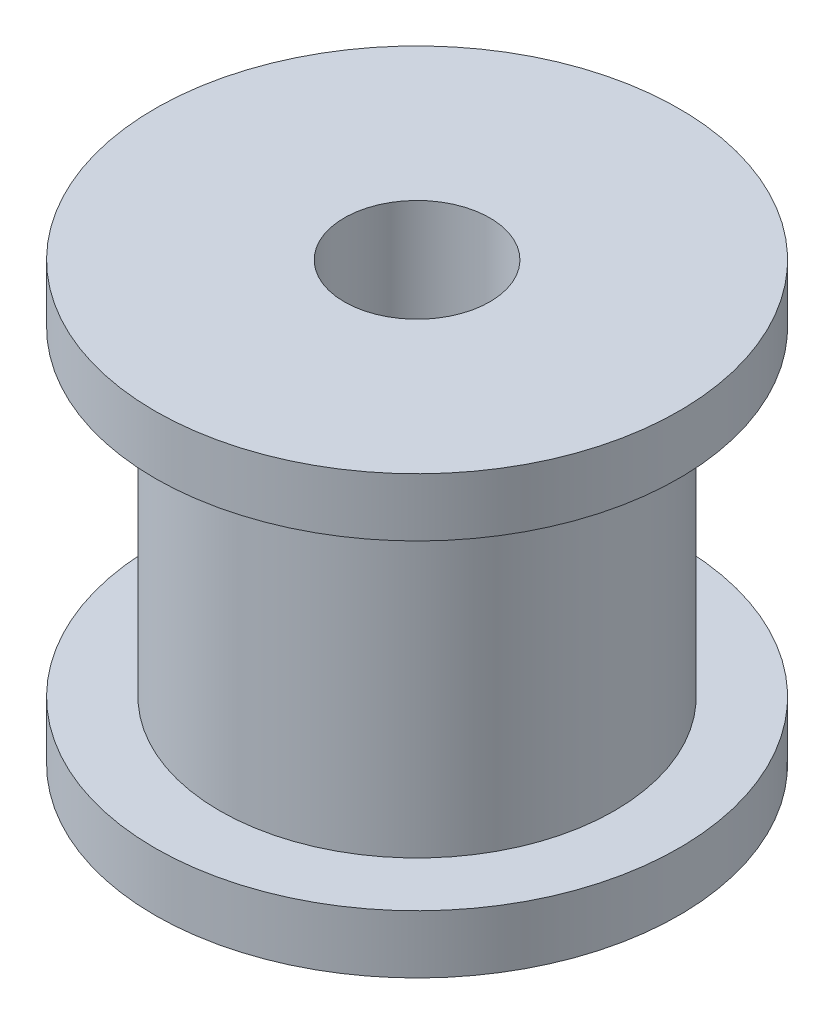
ISO-10303-21;
HEADER;
FILE_DESCRIPTION(('STEP AP214'),'2;1');
FILE_NAME('part.step','',(''),(''),'','','');
FILE_SCHEMA(('AUTOMOTIVE_DESIGN { 1 0 10303 214 1 1 1 1 }'));
ENDSEC;
DATA;
#1=APPLICATION_CONTEXT('core data for automotive mechanical design processes');
#2=APPLICATION_PROTOCOL_DEFINITION('international standard','automotive_design',2000,#1);
#3=PRODUCT_CONTEXT('',#1,'mechanical');
#4=PRODUCT('Part','Part','',(#3));
#5=PRODUCT_RELATED_PRODUCT_CATEGORY('part','',(#4));
#6=PRODUCT_DEFINITION_FORMATION('','',#4);
#7=PRODUCT_DEFINITION_CONTEXT('part definition',#1,'design');
#8=PRODUCT_DEFINITION('design','',#6,#7);
#9=PRODUCT_DEFINITION_SHAPE('','',#8);
#10=(LENGTH_UNIT() NAMED_UNIT(*) SI_UNIT(.MILLI.,.METRE.));
#11=(NAMED_UNIT(*) PLANE_ANGLE_UNIT() SI_UNIT($,.RADIAN.));
#12=(NAMED_UNIT(*) SI_UNIT($,.STERADIAN.) SOLID_ANGLE_UNIT());
#13=UNCERTAINTY_MEASURE_WITH_UNIT(LENGTH_MEASURE(1.E-05),#10,'distance_accuracy_value','');
#14=(GEOMETRIC_REPRESENTATION_CONTEXT(3) GLOBAL_UNCERTAINTY_ASSIGNED_CONTEXT((#13)) GLOBAL_UNIT_ASSIGNED_CONTEXT((#10,
#11,#12)) REPRESENTATION_CONTEXT('',''));
#15=CARTESIAN_POINT('',(0.,0.,0.));
#16=DIRECTION('',(0.,0.,1.));
#17=DIRECTION('',(1.,0.,0.));
#18=AXIS2_PLACEMENT_3D('',#15,#16,#17);
#19=CARTESIAN_POINT('',(0.,2.,0.));
#20=DIRECTION('',(0.,-1.,0.));
#21=DIRECTION('',(0.,0.,-1.));
#22=AXIS2_PLACEMENT_3D('',#19,#20,#21);
#23=CYLINDRICAL_SURFACE('',#22,9.);
#24=CARTESIAN_POINT('',(0.,2.,0.));
#25=DIRECTION('',(0.,1.,0.));
#26=DIRECTION('',(0.,0.,1.));
#27=AXIS2_PLACEMENT_3D('',#24,#25,#26);
#28=CIRCLE('',#27,9.);
#29=CARTESIAN_POINT('',(0.,2.,9.));
#30=VERTEX_POINT('',#29);
#31=EDGE_CURVE('E49',#30,#30,#28,.T.);
#32=ORIENTED_EDGE('',*,*,#31,.F.);
#33=EDGE_LOOP('',(#32));
#34=FACE_BOUND('',#33,.T.);
#35=CARTESIAN_POINT('',(0.,0.,0.));
#36=DIRECTION('',(0.,1.,0.));
#37=DIRECTION('',(0.,0.,1.));
#38=AXIS2_PLACEMENT_3D('',#35,#36,#37);
#39=CIRCLE('',#38,9.);
#40=CARTESIAN_POINT('',(0.,0.,9.));
#41=VERTEX_POINT('',#40);
#42=EDGE_CURVE('E44',#41,#41,#39,.T.);
#43=ORIENTED_EDGE('',*,*,#42,.T.);
#44=EDGE_LOOP('',(#43));
#45=FACE_BOUND('',#44,.T.);
#46=ADVANCED_FACE('F41',(#34,#45),#23,.T.);
#47=CARTESIAN_POINT('',(0.,2.,0.));
#48=DIRECTION('',(0.,1.,0.));
#49=DIRECTION('',(0.,0.,1.));
#50=AXIS2_PLACEMENT_3D('',#47,#48,#49);
#51=PLANE('',#50);
#52=CARTESIAN_POINT('',(0.,2.,0.));
#53=DIRECTION('',(0.,1.,0.));
#54=DIRECTION('',(0.,0.,1.));
#55=AXIS2_PLACEMENT_3D('',#52,#53,#54);
#56=CIRCLE('',#55,6.78);
#57=CARTESIAN_POINT('',(0.,2.,6.78));
#58=VERTEX_POINT('',#57);
#59=EDGE_CURVE('E10',#58,#58,#56,.T.);
#60=ORIENTED_EDGE('',*,*,#59,.F.);
#61=EDGE_LOOP('',(#60));
#62=FACE_BOUND('',#61,.T.);
#63=ORIENTED_EDGE('',*,*,#31,.T.);
#64=EDGE_LOOP('',(#63));
#65=FACE_BOUND('',#64,.T.);
#66=ADVANCED_FACE('F102',(#62,#65),#51,.T.);
#67=CARTESIAN_POINT('',(0.,0.,0.));
#68=DIRECTION('',(0.,1.,0.));
#69=DIRECTION('',(0.,0.,1.));
#70=AXIS2_PLACEMENT_3D('',#67,#68,#69);
#71=PLANE('',#70);
#72=CARTESIAN_POINT('',(0.,0.,0.));
#73=DIRECTION('',(0.,1.,0.));
#74=DIRECTION('',(0.,0.,1.));
#75=AXIS2_PLACEMENT_3D('',#72,#73,#74);
#76=CIRCLE('',#75,2.5);
#77=CARTESIAN_POINT('',(0.,0.,2.5));
#78=VERTEX_POINT('',#77);
#79=EDGE_CURVE('E65',#78,#78,#76,.T.);
#80=ORIENTED_EDGE('',*,*,#79,.T.);
#81=EDGE_LOOP('',(#80));
#82=FACE_BOUND('',#81,.T.);
#83=ORIENTED_EDGE('',*,*,#42,.F.);
#84=EDGE_LOOP('',(#83));
#85=FACE_BOUND('',#84,.T.);
#86=ADVANCED_FACE('F107',(#82,#85),#71,.F.);
#87=CARTESIAN_POINT('',(0.,13.,0.));
#88=DIRECTION('',(0.,-1.,0.));
#89=DIRECTION('',(0.,0.,-1.));
#90=AXIS2_PLACEMENT_3D('',#87,#88,#89);
#91=CYLINDRICAL_SURFACE('',#90,6.78);
#92=CARTESIAN_POINT('',(0.,13.,0.));
#93=DIRECTION('',(0.,1.,0.));
#94=DIRECTION('',(0.,0.,1.));
#95=AXIS2_PLACEMENT_3D('',#92,#93,#94);
#96=CIRCLE('',#95,6.78);
#97=CARTESIAN_POINT('',(0.,13.,6.78));
#98=VERTEX_POINT('',#97);
#99=EDGE_CURVE('E56',#98,#98,#96,.T.);
#100=ORIENTED_EDGE('',*,*,#99,.F.);
#101=EDGE_LOOP('',(#100));
#102=FACE_BOUND('',#101,.T.);
#103=ORIENTED_EDGE('',*,*,#59,.T.);
#104=EDGE_LOOP('',(#103));
#105=FACE_BOUND('',#104,.T.);
#106=ADVANCED_FACE('F90',(#102,#105),#91,.T.);
#107=CARTESIAN_POINT('',(0.,15.,0.));
#108=DIRECTION('',(0.,-1.,0.));
#109=DIRECTION('',(0.,0.,-1.));
#110=AXIS2_PLACEMENT_3D('',#107,#108,#109);
#111=CYLINDRICAL_SURFACE('',#110,9.);
#112=CARTESIAN_POINT('',(0.,15.,0.));
#113=DIRECTION('',(0.,1.,0.));
#114=DIRECTION('',(0.,0.,1.));
#115=AXIS2_PLACEMENT_3D('',#112,#113,#114);
#116=CIRCLE('',#115,9.);
#117=CARTESIAN_POINT('',(0.,15.,9.));
#118=VERTEX_POINT('',#117);
#119=EDGE_CURVE('E60',#118,#118,#116,.T.);
#120=ORIENTED_EDGE('',*,*,#119,.F.);
#121=EDGE_LOOP('',(#120));
#122=FACE_BOUND('',#121,.T.);
#123=CARTESIAN_POINT('',(0.,13.,0.));
#124=DIRECTION('',(0.,1.,0.));
#125=DIRECTION('',(0.,0.,1.));
#126=AXIS2_PLACEMENT_3D('',#123,#124,#125);
#127=CIRCLE('',#126,9.);
#128=CARTESIAN_POINT('',(0.,13.,9.));
#129=VERTEX_POINT('',#128);
#130=EDGE_CURVE('E61',#129,#129,#127,.T.);
#131=ORIENTED_EDGE('',*,*,#130,.T.);
#132=EDGE_LOOP('',(#131));
#133=FACE_BOUND('',#132,.T.);
#134=ADVANCED_FACE('F84',(#122,#133),#111,.T.);
#135=CARTESIAN_POINT('',(0.,15.,0.));
#136=DIRECTION('',(0.,1.,0.));
#137=DIRECTION('',(0.,0.,1.));
#138=AXIS2_PLACEMENT_3D('',#135,#136,#137);
#139=PLANE('',#138);
#140=CARTESIAN_POINT('',(0.,15.,0.));
#141=DIRECTION('',(0.,1.,0.));
#142=DIRECTION('',(0.,0.,1.));
#143=AXIS2_PLACEMENT_3D('',#140,#141,#142);
#144=CIRCLE('',#143,2.5);
#145=CARTESIAN_POINT('',(0.,15.,2.5));
#146=VERTEX_POINT('',#145);
#147=EDGE_CURVE('E72',#146,#146,#144,.T.);
#148=ORIENTED_EDGE('',*,*,#147,.F.);
#149=EDGE_LOOP('',(#148));
#150=FACE_BOUND('',#149,.T.);
#151=ORIENTED_EDGE('',*,*,#119,.T.);
#152=EDGE_LOOP('',(#151));
#153=FACE_BOUND('',#152,.T.);
#154=ADVANCED_FACE('F80',(#150,#153),#139,.T.);
#155=CARTESIAN_POINT('',(0.,13.,0.));
#156=DIRECTION('',(0.,1.,0.));
#157=DIRECTION('',(0.,0.,1.));
#158=AXIS2_PLACEMENT_3D('',#155,#156,#157);
#159=PLANE('',#158);
#160=ORIENTED_EDGE('',*,*,#99,.T.);
#161=EDGE_LOOP('',(#160));
#162=FACE_BOUND('',#161,.T.);
#163=ORIENTED_EDGE('',*,*,#130,.F.);
#164=EDGE_LOOP('',(#163));
#165=FACE_BOUND('',#164,.T.);
#166=ADVANCED_FACE('F83',(#162,#165),#159,.F.);
#167=CARTESIAN_POINT('',(0.,-11.,0.));
#168=DIRECTION('',(0.,1.,0.));
#169=DIRECTION('',(0.,0.,1.));
#170=AXIS2_PLACEMENT_3D('',#167,#168,#169);
#171=CYLINDRICAL_SURFACE('',#170,2.5);
#172=CARTESIAN_POINT('',(0.,15.,2.5));
#173=CARTESIAN_POINT('',(0.,14.84375,2.5));
#174=CARTESIAN_POINT('',(0.,14.6875,2.5));
#175=CARTESIAN_POINT('',(0.,14.375,2.5));
#176=CARTESIAN_POINT('',(0.,14.21875,2.5));
#177=CARTESIAN_POINT('',(0.,13.90625,2.5));
#178=CARTESIAN_POINT('',(0.,13.75,2.5));
#179=CARTESIAN_POINT('',(0.,13.4375,2.5));
#180=CARTESIAN_POINT('',(0.,13.28125,2.5));
#181=CARTESIAN_POINT('',(0.,12.96875,2.5));
#182=CARTESIAN_POINT('',(0.,12.8125,2.5));
#183=CARTESIAN_POINT('',(0.,12.5,2.5));
#184=CARTESIAN_POINT('',(0.,12.34375,2.5));
#185=CARTESIAN_POINT('',(0.,12.03125,2.5));
#186=CARTESIAN_POINT('',(0.,11.875,2.5));
#187=CARTESIAN_POINT('',(0.,11.5625,2.5));
#188=CARTESIAN_POINT('',(0.,11.40625,2.5));
#189=CARTESIAN_POINT('',(0.,11.09375,2.5));
#190=CARTESIAN_POINT('',(0.,10.9375,2.5));
#191=CARTESIAN_POINT('',(0.,10.625,2.5));
#192=CARTESIAN_POINT('',(0.,10.46875,2.5));
#193=CARTESIAN_POINT('',(0.,10.15625,2.5));
#194=CARTESIAN_POINT('',(0.,10.,2.5));
#195=CARTESIAN_POINT('',(0.,9.6875,2.5));
#196=CARTESIAN_POINT('',(0.,9.53125,2.5));
#197=CARTESIAN_POINT('',(0.,9.21875,2.5));
#198=CARTESIAN_POINT('',(0.,9.0625,2.5));
#199=CARTESIAN_POINT('',(0.,8.75,2.5));
#200=CARTESIAN_POINT('',(0.,8.59375,2.5));
#201=CARTESIAN_POINT('',(0.,8.28125,2.5));
#202=CARTESIAN_POINT('',(0.,8.125,2.5));
#203=CARTESIAN_POINT('',(0.,7.8125,2.5));
#204=CARTESIAN_POINT('',(0.,7.65625,2.5));
#205=CARTESIAN_POINT('',(0.,7.34375,2.5));
#206=CARTESIAN_POINT('',(0.,7.1875,2.5));
#207=CARTESIAN_POINT('',(0.,6.875,2.5));
#208=CARTESIAN_POINT('',(0.,6.71875,2.5));
#209=CARTESIAN_POINT('',(0.,6.40625,2.5));
#210=CARTESIAN_POINT('',(0.,6.25,2.5));
#211=CARTESIAN_POINT('',(0.,5.9375,2.5));
#212=CARTESIAN_POINT('',(0.,5.78125,2.5));
#213=CARTESIAN_POINT('',(0.,5.46875,2.5));
#214=CARTESIAN_POINT('',(0.,5.3125,2.5));
#215=CARTESIAN_POINT('',(0.,5.,2.5));
#216=CARTESIAN_POINT('',(0.,4.84375,2.5));
#217=CARTESIAN_POINT('',(0.,4.53125,2.5));
#218=CARTESIAN_POINT('',(0.,4.375,2.5));
#219=CARTESIAN_POINT('',(0.,4.0625,2.5));
#220=CARTESIAN_POINT('',(0.,3.90625,2.5));
#221=CARTESIAN_POINT('',(0.,3.59375,2.5));
#222=CARTESIAN_POINT('',(0.,3.4375,2.5));
#223=CARTESIAN_POINT('',(0.,3.125,2.5));
#224=CARTESIAN_POINT('',(0.,2.96875,2.5));
#225=CARTESIAN_POINT('',(0.,2.65625,2.5));
#226=CARTESIAN_POINT('',(0.,2.5,2.5));
#227=CARTESIAN_POINT('',(0.,2.1875,2.5));
#228=CARTESIAN_POINT('',(0.,2.03125,2.5));
#229=CARTESIAN_POINT('',(0.,1.71875,2.5));
#230=CARTESIAN_POINT('',(0.,1.5625,2.5));
#231=CARTESIAN_POINT('',(0.,1.25,2.5));
#232=CARTESIAN_POINT('',(0.,1.09375,2.5));
#233=CARTESIAN_POINT('',(0.,0.781249999999999,2.5));
#234=CARTESIAN_POINT('',(0.,0.624999999999999,2.5));
#235=CARTESIAN_POINT('',(0.,0.312499999999999,2.5));
#236=CARTESIAN_POINT('',(0.,0.156249999999998,2.5));
#237=CARTESIAN_POINT('',(0.,0.,2.5));
#238=B_SPLINE_CURVE_WITH_KNOTS('',3,(#172,#173,#174,#175,#176,#177,#178,#179,#180,#181,#182,
#183,#184,#185,#186,#187,#188,#189,#190,#191,#192,#193,#194,#195,#196,#197,#198,#199,#200,#201,
#202,#203,#204,#205,#206,#207,#208,#209,#210,#211,#212,#213,#214,#215,#216,#217,#218,#219,#220,
#221,#222,#223,#224,#225,#226,#227,#228,#229,#230,#231,#232,#233,#234,#235,#236,#237),
.UNSPECIFIED.,.F.,.F.,(4,2,2,2,2,2,2,2,2,2,2,2,2,2,2,2,2,2,2,2,2,2,2,2,2,2,2,2,2,2,2,2,4),(0.,
0.46875,0.937500000000001,1.40625,1.875,2.34375,2.8125,3.28125,3.75,4.21875,4.6875,5.15625,
5.625,6.09375,6.5625,7.03125,7.5,7.96875,8.4375,8.90625,9.375,9.84375,10.3125,10.78125,11.25,
11.71875,12.1875,12.65625,13.125,13.59375,14.0625,14.53125,15.),.UNSPECIFIED.);
#239=EDGE_CURVE('BSEAM77',#146,#78,#238,.T.);
#240=ORIENTED_EDGE('',*,*,#147,.T.);
#241=ORIENTED_EDGE('',*,*,#79,.F.);
#242=ORIENTED_EDGE('',*,*,#239,.T.);
#243=ORIENTED_EDGE('',*,*,#239,.F.);
#244=EDGE_LOOP('',(#240,#242,#241,#243));
#245=FACE_BOUND('',#244,.T.);
#246=ADVANCED_FACE('F77',(#245),#171,.F.);
#247=CLOSED_SHELL('',(#46,#66,#86,#106,#134,#154,#166,#246));
#248=MANIFOLD_SOLID_BREP('B2',#247);
#249=ADVANCED_BREP_SHAPE_REPRESENTATION('',(#18,#248),#14);
#250=SHAPE_DEFINITION_REPRESENTATION(#9,#249);
ENDSEC;
END-ISO-10303-21;
